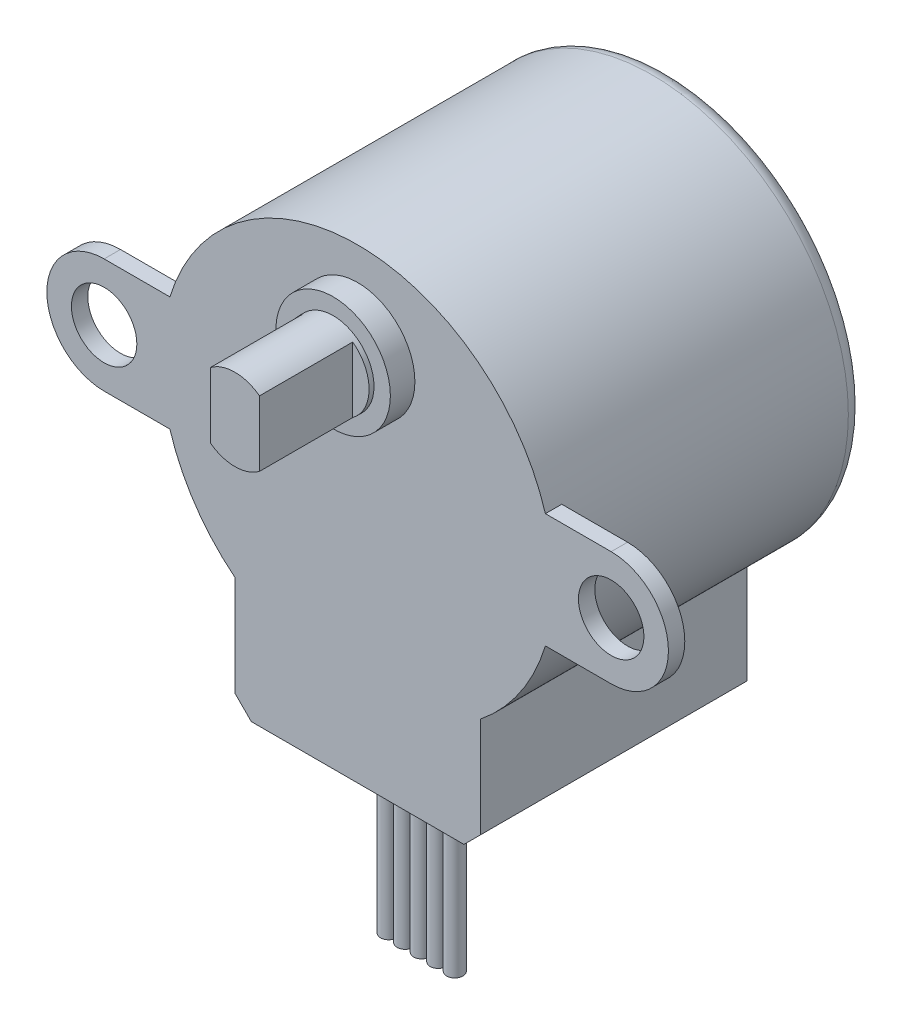
ISO-10303-21;
HEADER;
FILE_DESCRIPTION(('STEP AP214'),'2;1');
FILE_NAME('part.step','',(''),(''),'','','');
FILE_SCHEMA(('AUTOMOTIVE_DESIGN { 1 0 10303 214 1 1 1 1 }'));
ENDSEC;
DATA;
#1=APPLICATION_CONTEXT('core data for automotive mechanical design processes');
#2=APPLICATION_PROTOCOL_DEFINITION('international standard','automotive_design',2000,#1);
#3=PRODUCT_CONTEXT('',#1,'mechanical');
#4=PRODUCT('Part','Part','',(#3));
#5=PRODUCT_RELATED_PRODUCT_CATEGORY('part','',(#4));
#6=PRODUCT_DEFINITION_FORMATION('','',#4);
#7=PRODUCT_DEFINITION_CONTEXT('part definition',#1,'design');
#8=PRODUCT_DEFINITION('design','',#6,#7);
#9=PRODUCT_DEFINITION_SHAPE('','',#8);
#10=(LENGTH_UNIT() NAMED_UNIT(*) SI_UNIT(.MILLI.,.METRE.));
#11=(NAMED_UNIT(*) PLANE_ANGLE_UNIT() SI_UNIT($,.RADIAN.));
#12=(NAMED_UNIT(*) SI_UNIT($,.STERADIAN.) SOLID_ANGLE_UNIT());
#13=UNCERTAINTY_MEASURE_WITH_UNIT(LENGTH_MEASURE(1.E-05),#10,'distance_accuracy_value','');
#14=(GEOMETRIC_REPRESENTATION_CONTEXT(3) GLOBAL_UNCERTAINTY_ASSIGNED_CONTEXT((#13)) GLOBAL_UNIT_ASSIGNED_CONTEXT((#10,
#11,#12)) REPRESENTATION_CONTEXT('',''));
#15=CARTESIAN_POINT('',(0.,0.,0.));
#16=DIRECTION('',(0.,0.,1.));
#17=DIRECTION('',(1.,0.,0.));
#18=AXIS2_PLACEMENT_3D('',#15,#16,#17);
#19=CARTESIAN_POINT('',(0.,0.,19.));
#20=DIRECTION('',(0.,0.,-1.));
#21=DIRECTION('',(-1.,0.,0.));
#22=AXIS2_PLACEMENT_3D('',#19,#20,#21);
#23=CYLINDRICAL_SURFACE('',#22,12.);
#24=CARTESIAN_POINT('',(0.,0.,1.));
#25=DIRECTION('',(0.,0.,1.));
#26=DIRECTION('',(1.,0.,0.));
#27=AXIS2_PLACEMENT_3D('',#24,#25,#26);
#28=CIRCLE('',#27,12.);
#29=CARTESIAN_POINT('',(12.,0.,1.));
#30=VERTEX_POINT('',#29);
#31=EDGE_CURVE('E44',#30,#30,#28,.T.);
#32=ORIENTED_EDGE('',*,*,#31,.T.);
#33=EDGE_LOOP('',(#32));
#34=FACE_BOUND('',#33,.T.);
#35=CARTESIAN_POINT('',(0.,0.,2.7));
#36=DIRECTION('',(0.,0.,-1.));
#37=DIRECTION('',(1.,0.,0.));
#38=AXIS2_PLACEMENT_3D('',#35,#36,#37);
#39=CIRCLE('',#38,12.0000000000001);
#40=CARTESIAN_POINT('',(7.5,-9.3674969975976,2.7));
#41=VERTEX_POINT('',#40);
#42=CARTESIAN_POINT('',(-7.5,-9.3674969975976,2.7));
#43=VERTEX_POINT('',#42);
#44=EDGE_CURVE('E238',#41,#43,#39,.T.);
#45=ORIENTED_EDGE('',*,*,#44,.T.);
#46=DIRECTION('',(0.,0.,1.));
#47=VECTOR('',#46,1.);
#48=CARTESIAN_POINT('',(-7.5,-9.3674969975976,2.7));
#49=LINE('',#48,#47);
#50=CARTESIAN_POINT('',(-7.5,-9.3674969975976,19.));
#51=VERTEX_POINT('',#50);
#52=EDGE_CURVE('E248',#43,#51,#49,.T.);
#53=ORIENTED_EDGE('',*,*,#52,.T.);
#54=CARTESIAN_POINT('',(0.,0.,19.));
#55=DIRECTION('',(0.,0.,1.));
#56=DIRECTION('',(1.,0.,0.));
#57=AXIS2_PLACEMENT_3D('',#54,#55,#56);
#58=CIRCLE('',#57,12.);
#59=CARTESIAN_POINT('',(-11.478240283249,-3.5,19.));
#60=VERTEX_POINT('',#59);
#61=EDGE_CURVE('E286',#60,#51,#58,.T.);
#62=ORIENTED_EDGE('',*,*,#61,.F.);
#63=DIRECTION('',(0.,0.,1.));
#64=VECTOR('',#63,1.);
#65=CARTESIAN_POINT('',(-11.478240283249,-3.49999999999999,18.));
#66=LINE('',#65,#64);
#67=CARTESIAN_POINT('',(-11.478240283249,-3.49999999999999,18.));
#68=VERTEX_POINT('',#67);
#69=EDGE_CURVE('E361',#68,#60,#66,.T.);
#70=ORIENTED_EDGE('',*,*,#69,.F.);
#71=CARTESIAN_POINT('',(3.17454396103756E-13,0.,18.));
#72=DIRECTION('',(0.,0.,-1.));
#73=DIRECTION('',(1.,0.,0.));
#74=AXIS2_PLACEMENT_3D('',#71,#72,#73);
#75=CIRCLE('',#74,12.0000000000003);
#76=CARTESIAN_POINT('',(-11.478240283249,3.5,18.));
#77=VERTEX_POINT('',#76);
#78=EDGE_CURVE('E342',#68,#77,#75,.T.);
#79=ORIENTED_EDGE('',*,*,#78,.T.);
#80=DIRECTION('',(0.,0.,1.));
#81=VECTOR('',#80,1.);
#82=CARTESIAN_POINT('',(-11.478240283249,3.5,18.));
#83=LINE('',#82,#81);
#84=CARTESIAN_POINT('',(-11.478240283249,3.5,19.));
#85=VERTEX_POINT('',#84);
#86=EDGE_CURVE('E358',#77,#85,#83,.T.);
#87=ORIENTED_EDGE('',*,*,#86,.T.);
#88=CARTESIAN_POINT('',(11.478240283249,3.50000000000001,19.));
#89=VERTEX_POINT('',#88);
#90=EDGE_CURVE('E357',#89,#85,#58,.T.);
#91=ORIENTED_EDGE('',*,*,#90,.F.);
#92=DIRECTION('',(0.,0.,1.));
#93=VECTOR('',#92,1.);
#94=CARTESIAN_POINT('',(11.478240283249,3.50000000000001,18.));
#95=LINE('',#94,#93);
#96=CARTESIAN_POINT('',(11.478240283249,3.50000000000001,18.));
#97=VERTEX_POINT('',#96);
#98=EDGE_CURVE('E319',#97,#89,#95,.T.);
#99=ORIENTED_EDGE('',*,*,#98,.F.);
#100=CARTESIAN_POINT('',(3.17454396103756E-13,0.,18.));
#101=DIRECTION('',(0.,0.,-1.));
#102=DIRECTION('',(-1.,0.,0.));
#103=AXIS2_PLACEMENT_3D('',#100,#101,#102);
#104=CIRCLE('',#103,11.9999999999997);
#105=CARTESIAN_POINT('',(11.478240283249,-3.49999999999999,18.));
#106=VERTEX_POINT('',#105);
#107=EDGE_CURVE('E299',#97,#106,#104,.T.);
#108=ORIENTED_EDGE('',*,*,#107,.T.);
#109=DIRECTION('',(0.,0.,1.));
#110=VECTOR('',#109,1.);
#111=CARTESIAN_POINT('',(11.478240283249,-3.49999999999999,18.));
#112=LINE('',#111,#110);
#113=CARTESIAN_POINT('',(11.478240283249,-3.49999999999999,19.));
#114=VERTEX_POINT('',#113);
#115=EDGE_CURVE('E312',#106,#114,#112,.T.);
#116=ORIENTED_EDGE('',*,*,#115,.T.);
#117=CARTESIAN_POINT('',(7.5,-9.3674969975976,19.));
#118=VERTEX_POINT('',#117);
#119=EDGE_CURVE('E367',#118,#114,#58,.T.);
#120=ORIENTED_EDGE('',*,*,#119,.F.);
#121=DIRECTION('',(0.,0.,1.));
#122=VECTOR('',#121,1.);
#123=CARTESIAN_POINT('',(7.5,-9.3674969975976,2.7));
#124=LINE('',#123,#122);
#125=EDGE_CURVE('E241',#41,#118,#124,.T.);
#126=ORIENTED_EDGE('',*,*,#125,.F.);
#127=EDGE_LOOP('',(#45,#53,#62,#70,#79,#87,#91,#99,#108,#116,#120,#126));
#128=FACE_BOUND('',#127,.T.);
#129=ADVANCED_FACE('F36',(#34,#128),#23,.T.);
#130=CARTESIAN_POINT('',(0.,0.,19.));
#131=DIRECTION('',(0.,0.,1.));
#132=DIRECTION('',(1.,0.,0.));
#133=AXIS2_PLACEMENT_3D('',#130,#131,#132);
#134=PLANE('',#133);
#135=CARTESIAN_POINT('',(0.,6.5,19.));
#136=DIRECTION('',(0.,0.,1.));
#137=DIRECTION('',(1.,0.,0.));
#138=AXIS2_PLACEMENT_3D('',#135,#136,#137);
#139=CIRCLE('',#138,3.5);
#140=CARTESIAN_POINT('',(3.5,6.5,19.));
#141=VERTEX_POINT('',#140);
#142=EDGE_CURVE('E281',#141,#141,#139,.T.);
#143=ORIENTED_EDGE('',*,*,#142,.F.);
#144=EDGE_LOOP('',(#143));
#145=FACE_BOUND('',#144,.T.);
#146=DIRECTION('',(1.,0.,0.));
#147=VECTOR('',#146,1.);
#148=CARTESIAN_POINT('',(-7.5,-16.5,19.));
#149=LINE('',#148,#147);
#150=CARTESIAN_POINT('',(-6.5,-16.5,19.));
#151=VERTEX_POINT('',#150);
#152=CARTESIAN_POINT('',(6.5,-16.5,19.));
#153=VERTEX_POINT('',#152);
#154=EDGE_CURVE('E244',#151,#153,#149,.T.);
#155=ORIENTED_EDGE('',*,*,#154,.T.);
#156=DIRECTION('',(-0.707106781186548,-0.707106781186548,0.));
#157=VECTOR('',#156,1.);
#158=CARTESIAN_POINT('',(11.5,-11.5,19.));
#159=LINE('',#158,#157);
#160=CARTESIAN_POINT('',(7.5,-15.5,19.));
#161=VERTEX_POINT('',#160);
#162=EDGE_CURVE('E374',#153,#161,#159,.F.);
#163=ORIENTED_EDGE('',*,*,#162,.T.);
#164=DIRECTION('',(0.,1.,0.));
#165=VECTOR('',#164,1.);
#166=CARTESIAN_POINT('',(7.5,-16.5,19.));
#167=LINE('',#166,#165);
#168=EDGE_CURVE('E233',#161,#118,#167,.T.);
#169=ORIENTED_EDGE('',*,*,#168,.T.);
#170=ORIENTED_EDGE('',*,*,#119,.T.);
#171=DIRECTION('',(1.,0.,0.));
#172=VECTOR('',#171,1.);
#173=CARTESIAN_POINT('',(15.5,-3.49999999999999,19.));
#174=LINE('',#173,#172);
#175=CARTESIAN_POINT('',(15.5,-3.49999999999999,19.));
#176=VERTEX_POINT('',#175);
#177=EDGE_CURVE('E296',#114,#176,#174,.T.);
#178=ORIENTED_EDGE('',*,*,#177,.T.);
#179=CARTESIAN_POINT('',(15.5,0.,19.));
#180=DIRECTION('',(0.,0.,1.));
#181=DIRECTION('',(-1.,0.,0.));
#182=AXIS2_PLACEMENT_3D('',#179,#180,#181);
#183=CIRCLE('',#182,3.5);
#184=CARTESIAN_POINT('',(15.5,3.50000000000001,19.));
#185=VERTEX_POINT('',#184);
#186=EDGE_CURVE('E315',#176,#185,#183,.T.);
#187=ORIENTED_EDGE('',*,*,#186,.T.);
#188=DIRECTION('',(-1.,0.,0.));
#189=VECTOR('',#188,1.);
#190=CARTESIAN_POINT('',(15.5,3.50000000000001,19.));
#191=LINE('',#190,#189);
#192=EDGE_CURVE('E303',#185,#89,#191,.T.);
#193=ORIENTED_EDGE('',*,*,#192,.T.);
#194=ORIENTED_EDGE('',*,*,#90,.T.);
#195=DIRECTION('',(-1.,0.,0.));
#196=VECTOR('',#195,1.);
#197=CARTESIAN_POINT('',(-15.5,3.5,19.));
#198=LINE('',#197,#196);
#199=CARTESIAN_POINT('',(-15.5,3.5,19.));
#200=VERTEX_POINT('',#199);
#201=EDGE_CURVE('E339',#85,#200,#198,.T.);
#202=ORIENTED_EDGE('',*,*,#201,.T.);
#203=CARTESIAN_POINT('',(-15.5,0.,19.));
#204=DIRECTION('',(0.,0.,1.));
#205=DIRECTION('',(1.,0.,0.));
#206=AXIS2_PLACEMENT_3D('',#203,#204,#205);
#207=CIRCLE('',#206,3.5);
#208=CARTESIAN_POINT('',(-15.5,-3.5,19.));
#209=VERTEX_POINT('',#208);
#210=EDGE_CURVE('E332',#200,#209,#207,.T.);
#211=ORIENTED_EDGE('',*,*,#210,.T.);
#212=DIRECTION('',(1.,0.,0.));
#213=VECTOR('',#212,1.);
#214=CARTESIAN_POINT('',(-15.5,-3.5,19.));
#215=LINE('',#214,#213);
#216=EDGE_CURVE('E351',#209,#60,#215,.T.);
#217=ORIENTED_EDGE('',*,*,#216,.T.);
#218=ORIENTED_EDGE('',*,*,#61,.T.);
#219=DIRECTION('',(0.,-1.,0.));
#220=VECTOR('',#219,1.);
#221=CARTESIAN_POINT('',(-7.5,-16.5,19.));
#222=LINE('',#221,#220);
#223=CARTESIAN_POINT('',(-7.5,-15.5,19.));
#224=VERTEX_POINT('',#223);
#225=EDGE_CURVE('E226',#51,#224,#222,.T.);
#226=ORIENTED_EDGE('',*,*,#225,.T.);
#227=DIRECTION('',(-0.707106781186545,0.70710678118655,0.));
#228=VECTOR('',#227,1.);
#229=CARTESIAN_POINT('',(-11.5,-11.4999999999999,19.));
#230=LINE('',#229,#228);
#231=EDGE_CURVE('E372',#224,#151,#230,.F.);
#232=ORIENTED_EDGE('',*,*,#231,.T.);
#233=EDGE_LOOP('',(#155,#163,#169,#170,#178,#187,#193,#194,#202,#211,#217,#218,#226,#232));
#234=FACE_BOUND('',#233,.T.);
#235=CARTESIAN_POINT('',(-15.5,0.,19.));
#236=DIRECTION('',(0.,0.,1.));
#237=DIRECTION('',(1.,0.,0.));
#238=AXIS2_PLACEMENT_3D('',#235,#236,#237);
#239=CIRCLE('',#238,2.);
#240=CARTESIAN_POINT('',(-13.5,0.,19.));
#241=VERTEX_POINT('',#240);
#242=EDGE_CURVE('E322',#241,#241,#239,.T.);
#243=ORIENTED_EDGE('',*,*,#242,.F.);
#244=EDGE_LOOP('',(#243));
#245=FACE_BOUND('',#244,.T.);
#246=CARTESIAN_POINT('',(15.5,0.,19.));
#247=DIRECTION('',(0.,0.,1.));
#248=DIRECTION('',(-1.,0.,0.));
#249=AXIS2_PLACEMENT_3D('',#246,#247,#248);
#250=CIRCLE('',#249,2.);
#251=CARTESIAN_POINT('',(13.5,0.,19.));
#252=VERTEX_POINT('',#251);
#253=EDGE_CURVE('E290',#252,#252,#250,.T.);
#254=ORIENTED_EDGE('',*,*,#253,.F.);
#255=EDGE_LOOP('',(#254));
#256=FACE_BOUND('',#255,.T.);
#257=ADVANCED_FACE('F401',(#145,#234,#245,#256),#134,.T.);
#258=CARTESIAN_POINT('',(0.,0.,0.));
#259=DIRECTION('',(0.,0.,1.));
#260=DIRECTION('',(1.,0.,0.));
#261=AXIS2_PLACEMENT_3D('',#258,#259,#260);
#262=PLANE('',#261);
#263=CARTESIAN_POINT('',(0.,0.,0.));
#264=DIRECTION('',(0.,0.,1.));
#265=DIRECTION('',(1.,0.,0.));
#266=AXIS2_PLACEMENT_3D('',#263,#264,#265);
#267=CIRCLE('',#266,11.);
#268=CARTESIAN_POINT('',(11.,0.,0.));
#269=VERTEX_POINT('',#268);
#270=EDGE_CURVE('E11',#269,#269,#267,.F.);
#271=ORIENTED_EDGE('',*,*,#270,.T.);
#272=EDGE_LOOP('',(#271));
#273=FACE_BOUND('',#272,.T.);
#274=ADVANCED_FACE('F406',(#273),#262,.F.);
#275=CARTESIAN_POINT('',(-15.5,0.,18.));
#276=DIRECTION('',(0.,0.,1.));
#277=DIRECTION('',(1.,0.,0.));
#278=AXIS2_PLACEMENT_3D('',#275,#276,#277);
#279=CYLINDRICAL_SURFACE('',#278,3.5);
#280=ORIENTED_EDGE('',*,*,#210,.F.);
#281=DIRECTION('',(0.,0.,1.));
#282=VECTOR('',#281,1.);
#283=CARTESIAN_POINT('',(-15.5,3.5,18.));
#284=LINE('',#283,#282);
#285=CARTESIAN_POINT('',(-15.5,3.5,18.));
#286=VERTEX_POINT('',#285);
#287=EDGE_CURVE('E355',#286,#200,#284,.T.);
#288=ORIENTED_EDGE('',*,*,#287,.F.);
#289=CARTESIAN_POINT('',(-15.5,0.,18.));
#290=DIRECTION('',(0.,0.,1.));
#291=DIRECTION('',(1.,0.,0.));
#292=AXIS2_PLACEMENT_3D('',#289,#290,#291);
#293=CIRCLE('',#292,3.5);
#294=CARTESIAN_POINT('',(-15.5,-3.5,18.));
#295=VERTEX_POINT('',#294);
#296=EDGE_CURVE('E335',#286,#295,#293,.T.);
#297=ORIENTED_EDGE('',*,*,#296,.T.);
#298=DIRECTION('',(0.,0.,1.));
#299=VECTOR('',#298,1.);
#300=CARTESIAN_POINT('',(-15.5,-3.5,18.));
#301=LINE('',#300,#299);
#302=EDGE_CURVE('E348',#295,#209,#301,.T.);
#303=ORIENTED_EDGE('',*,*,#302,.T.);
#304=EDGE_LOOP('',(#280,#288,#297,#303));
#305=FACE_BOUND('',#304,.T.);
#306=ADVANCED_FACE('F468',(#305),#279,.T.);
#307=CARTESIAN_POINT('',(-15.5,3.5,18.));
#308=DIRECTION('',(0.,1.,0.));
#309=DIRECTION('',(0.,0.,1.));
#310=AXIS2_PLACEMENT_3D('',#307,#308,#309);
#311=PLANE('',#310);
#312=ORIENTED_EDGE('',*,*,#201,.F.);
#313=ORIENTED_EDGE('',*,*,#86,.F.);
#314=DIRECTION('',(-1.,0.,0.));
#315=VECTOR('',#314,1.);
#316=CARTESIAN_POINT('',(-15.5,3.5,18.));
#317=LINE('',#316,#315);
#318=EDGE_CURVE('E345',#77,#286,#317,.T.);
#319=ORIENTED_EDGE('',*,*,#318,.T.);
#320=ORIENTED_EDGE('',*,*,#287,.T.);
#321=EDGE_LOOP('',(#312,#313,#319,#320));
#322=FACE_BOUND('',#321,.T.);
#323=ADVANCED_FACE('F458',(#322),#311,.T.);
#324=CARTESIAN_POINT('',(-15.5,-3.5,18.));
#325=DIRECTION('',(0.,-1.,0.));
#326=DIRECTION('',(0.,0.,-1.));
#327=AXIS2_PLACEMENT_3D('',#324,#325,#326);
#328=PLANE('',#327);
#329=ORIENTED_EDGE('',*,*,#216,.F.);
#330=ORIENTED_EDGE('',*,*,#302,.F.);
#331=DIRECTION('',(1.,0.,0.));
#332=VECTOR('',#331,1.);
#333=CARTESIAN_POINT('',(-15.5,-3.5,18.));
#334=LINE('',#333,#332);
#335=EDGE_CURVE('E338',#295,#68,#334,.T.);
#336=ORIENTED_EDGE('',*,*,#335,.T.);
#337=ORIENTED_EDGE('',*,*,#69,.T.);
#338=EDGE_LOOP('',(#329,#330,#336,#337));
#339=FACE_BOUND('',#338,.T.);
#340=ADVANCED_FACE('F466',(#339),#328,.T.);
#341=CARTESIAN_POINT('',(-15.5,0.,18.));
#342=DIRECTION('',(0.,0.,1.));
#343=DIRECTION('',(1.,0.,0.));
#344=AXIS2_PLACEMENT_3D('',#341,#342,#343);
#345=PLANE('',#344);
#346=CARTESIAN_POINT('',(-15.5,0.,18.));
#347=DIRECTION('',(0.,0.,1.));
#348=DIRECTION('',(1.,0.,0.));
#349=AXIS2_PLACEMENT_3D('',#346,#347,#348);
#350=CIRCLE('',#349,2.);
#351=CARTESIAN_POINT('',(-13.5,0.,18.));
#352=VERTEX_POINT('',#351);
#353=EDGE_CURVE('E329',#352,#352,#350,.T.);
#354=ORIENTED_EDGE('',*,*,#353,.T.);
#355=EDGE_LOOP('',(#354));
#356=FACE_BOUND('',#355,.T.);
#357=ORIENTED_EDGE('',*,*,#296,.F.);
#358=ORIENTED_EDGE('',*,*,#318,.F.);
#359=ORIENTED_EDGE('',*,*,#78,.F.);
#360=ORIENTED_EDGE('',*,*,#335,.F.);
#361=EDGE_LOOP('',(#357,#358,#359,#360));
#362=FACE_BOUND('',#361,.T.);
#363=ADVANCED_FACE('F464',(#356,#362),#345,.F.);
#364=CARTESIAN_POINT('',(-15.5,0.,18.));
#365=DIRECTION('',(0.,0.,1.));
#366=DIRECTION('',(1.,0.,0.));
#367=AXIS2_PLACEMENT_3D('',#364,#365,#366);
#368=CYLINDRICAL_SURFACE('',#367,2.);
#369=ORIENTED_EDGE('',*,*,#353,.F.);
#370=EDGE_LOOP('',(#369));
#371=FACE_BOUND('',#370,.T.);
#372=ORIENTED_EDGE('',*,*,#242,.T.);
#373=EDGE_LOOP('',(#372));
#374=FACE_BOUND('',#373,.T.);
#375=ADVANCED_FACE('F482',(#371,#374),#368,.F.);
#376=CARTESIAN_POINT('',(15.5,3.50000000000001,18.));
#377=DIRECTION('',(0.,1.,0.));
#378=DIRECTION('',(0.,0.,1.));
#379=AXIS2_PLACEMENT_3D('',#376,#377,#378);
#380=PLANE('',#379);
#381=ORIENTED_EDGE('',*,*,#192,.F.);
#382=DIRECTION('',(0.,0.,1.));
#383=VECTOR('',#382,1.);
#384=CARTESIAN_POINT('',(15.5,3.50000000000001,18.));
#385=LINE('',#384,#383);
#386=CARTESIAN_POINT('',(15.5,3.50000000000001,18.));
#387=VERTEX_POINT('',#386);
#388=EDGE_CURVE('E323',#387,#185,#385,.T.);
#389=ORIENTED_EDGE('',*,*,#388,.F.);
#390=DIRECTION('',(-1.,0.,0.));
#391=VECTOR('',#390,1.);
#392=CARTESIAN_POINT('',(15.5,3.50000000000001,18.));
#393=LINE('',#392,#391);
#394=EDGE_CURVE('E309',#387,#97,#393,.T.);
#395=ORIENTED_EDGE('',*,*,#394,.T.);
#396=ORIENTED_EDGE('',*,*,#98,.T.);
#397=EDGE_LOOP('',(#381,#389,#395,#396));
#398=FACE_BOUND('',#397,.T.);
#399=ADVANCED_FACE('F453',(#398),#380,.T.);
#400=CARTESIAN_POINT('',(15.5,0.,18.));
#401=DIRECTION('',(0.,0.,1.));
#402=DIRECTION('',(1.,0.,0.));
#403=AXIS2_PLACEMENT_3D('',#400,#401,#402);
#404=CYLINDRICAL_SURFACE('',#403,3.5);
#405=ORIENTED_EDGE('',*,*,#186,.F.);
#406=DIRECTION('',(0.,0.,1.));
#407=VECTOR('',#406,1.);
#408=CARTESIAN_POINT('',(15.5,-3.49999999999999,18.));
#409=LINE('',#408,#407);
#410=CARTESIAN_POINT('',(15.5,-3.49999999999999,18.));
#411=VERTEX_POINT('',#410);
#412=EDGE_CURVE('E325',#411,#176,#409,.T.);
#413=ORIENTED_EDGE('',*,*,#412,.F.);
#414=CARTESIAN_POINT('',(15.5,0.,18.));
#415=DIRECTION('',(0.,0.,1.));
#416=DIRECTION('',(-1.,0.,0.));
#417=AXIS2_PLACEMENT_3D('',#414,#415,#416);
#418=CIRCLE('',#417,3.5);
#419=EDGE_CURVE('E306',#411,#387,#418,.T.);
#420=ORIENTED_EDGE('',*,*,#419,.T.);
#421=ORIENTED_EDGE('',*,*,#388,.T.);
#422=EDGE_LOOP('',(#405,#413,#420,#421));
#423=FACE_BOUND('',#422,.T.);
#424=ADVANCED_FACE('F455',(#423),#404,.T.);
#425=CARTESIAN_POINT('',(15.5,-3.49999999999999,18.));
#426=DIRECTION('',(0.,-1.,0.));
#427=DIRECTION('',(0.,0.,-1.));
#428=AXIS2_PLACEMENT_3D('',#425,#426,#427);
#429=PLANE('',#428);
#430=ORIENTED_EDGE('',*,*,#177,.F.);
#431=ORIENTED_EDGE('',*,*,#115,.F.);
#432=DIRECTION('',(1.,0.,0.));
#433=VECTOR('',#432,1.);
#434=CARTESIAN_POINT('',(15.5,-3.49999999999999,18.));
#435=LINE('',#434,#433);
#436=EDGE_CURVE('E302',#106,#411,#435,.T.);
#437=ORIENTED_EDGE('',*,*,#436,.T.);
#438=ORIENTED_EDGE('',*,*,#412,.T.);
#439=EDGE_LOOP('',(#430,#431,#437,#438));
#440=FACE_BOUND('',#439,.T.);
#441=ADVANCED_FACE('F442',(#440),#429,.T.);
#442=CARTESIAN_POINT('',(3.17454396103756E-13,0.,18.));
#443=DIRECTION('',(0.,0.,-1.));
#444=DIRECTION('',(-1.,0.,0.));
#445=AXIS2_PLACEMENT_3D('',#442,#443,#444);
#446=PLANE('',#445);
#447=CARTESIAN_POINT('',(15.5,0.,18.));
#448=DIRECTION('',(0.,0.,1.));
#449=DIRECTION('',(-1.,0.,0.));
#450=AXIS2_PLACEMENT_3D('',#447,#448,#449);
#451=CIRCLE('',#450,2.);
#452=CARTESIAN_POINT('',(13.5,0.,18.));
#453=VERTEX_POINT('',#452);
#454=EDGE_CURVE('E293',#453,#453,#451,.T.);
#455=ORIENTED_EDGE('',*,*,#454,.T.);
#456=EDGE_LOOP('',(#455));
#457=FACE_BOUND('',#456,.T.);
#458=ORIENTED_EDGE('',*,*,#107,.F.);
#459=ORIENTED_EDGE('',*,*,#394,.F.);
#460=ORIENTED_EDGE('',*,*,#419,.F.);
#461=ORIENTED_EDGE('',*,*,#436,.F.);
#462=EDGE_LOOP('',(#458,#459,#460,#461));
#463=FACE_BOUND('',#462,.T.);
#464=ADVANCED_FACE('F449',(#457,#463),#446,.T.);
#465=CARTESIAN_POINT('',(15.5,0.,18.));
#466=DIRECTION('',(0.,0.,1.));
#467=DIRECTION('',(1.,0.,0.));
#468=AXIS2_PLACEMENT_3D('',#465,#466,#467);
#469=CYLINDRICAL_SURFACE('',#468,2.);
#470=ORIENTED_EDGE('',*,*,#454,.F.);
#471=EDGE_LOOP('',(#470));
#472=FACE_BOUND('',#471,.T.);
#473=ORIENTED_EDGE('',*,*,#253,.T.);
#474=EDGE_LOOP('',(#473));
#475=FACE_BOUND('',#474,.T.);
#476=ADVANCED_FACE('F495',(#472,#475),#469,.F.);
#477=CARTESIAN_POINT('',(0.,6.5,20.5));
#478=DIRECTION('',(0.,0.,-1.));
#479=DIRECTION('',(-1.,0.,0.));
#480=AXIS2_PLACEMENT_3D('',#477,#478,#479);
#481=CYLINDRICAL_SURFACE('',#480,3.5);
#482=CARTESIAN_POINT('',(0.,6.5,20.5));
#483=DIRECTION('',(0.,0.,1.));
#484=DIRECTION('',(1.,0.,0.));
#485=AXIS2_PLACEMENT_3D('',#482,#483,#484);
#486=CIRCLE('',#485,3.5);
#487=CARTESIAN_POINT('',(3.5,6.5,20.5));
#488=VERTEX_POINT('',#487);
#489=EDGE_CURVE('E287',#488,#488,#486,.T.);
#490=ORIENTED_EDGE('',*,*,#489,.F.);
#491=EDGE_LOOP('',(#490));
#492=FACE_BOUND('',#491,.T.);
#493=ORIENTED_EDGE('',*,*,#142,.T.);
#494=EDGE_LOOP('',(#493));
#495=FACE_BOUND('',#494,.T.);
#496=ADVANCED_FACE('F499',(#492,#495),#481,.T.);
#497=CARTESIAN_POINT('',(0.,6.5,20.5));
#498=DIRECTION('',(0.,0.,1.));
#499=DIRECTION('',(1.,0.,0.));
#500=AXIS2_PLACEMENT_3D('',#497,#498,#499);
#501=PLANE('',#500);
#502=CARTESIAN_POINT('',(0.,6.5,20.5));
#503=DIRECTION('',(0.,0.,1.));
#504=DIRECTION('',(1.,0.,0.));
#505=AXIS2_PLACEMENT_3D('',#502,#503,#504);
#506=CIRCLE('',#505,2.5);
#507=CARTESIAN_POINT('',(2.5,6.5,20.5));
#508=VERTEX_POINT('',#507);
#509=EDGE_CURVE('E282',#508,#508,#506,.T.);
#510=ORIENTED_EDGE('',*,*,#509,.F.);
#511=EDGE_LOOP('',(#510));
#512=FACE_BOUND('',#511,.T.);
#513=ORIENTED_EDGE('',*,*,#489,.T.);
#514=EDGE_LOOP('',(#513));
#515=FACE_BOUND('',#514,.T.);
#516=ADVANCED_FACE('F503',(#512,#515),#501,.T.);
#517=CARTESIAN_POINT('',(0.,6.5,26.5));
#518=DIRECTION('',(0.,0.,-1.));
#519=DIRECTION('',(-1.,0.,0.));
#520=AXIS2_PLACEMENT_3D('',#517,#518,#519);
#521=CYLINDRICAL_SURFACE('',#520,2.5);
#522=CARTESIAN_POINT('',(0.,6.5,26.5));
#523=DIRECTION('',(0.,0.,1.));
#524=DIRECTION('',(1.,0.,0.));
#525=AXIS2_PLACEMENT_3D('',#522,#523,#524);
#526=CIRCLE('',#525,2.5);
#527=CARTESIAN_POINT('',(-1.5,4.5,26.5));
#528=VERTEX_POINT('',#527);
#529=CARTESIAN_POINT('',(1.5,4.5,26.5));
#530=VERTEX_POINT('',#529);
#531=EDGE_CURVE('E266',#528,#530,#526,.T.);
#532=ORIENTED_EDGE('',*,*,#531,.F.);
#533=DIRECTION('',(0.,0.,1.));
#534=VECTOR('',#533,1.);
#535=CARTESIAN_POINT('',(-1.5,4.5,20.8));
#536=LINE('',#535,#534);
#537=CARTESIAN_POINT('',(-1.5,4.5,20.8));
#538=VERTEX_POINT('',#537);
#539=EDGE_CURVE('E260',#538,#528,#536,.T.);
#540=ORIENTED_EDGE('',*,*,#539,.F.);
#541=CARTESIAN_POINT('',(0.,6.5,20.8));
#542=DIRECTION('',(0.,0.,1.));
#543=DIRECTION('',(1.,0.,0.));
#544=AXIS2_PLACEMENT_3D('',#541,#542,#543);
#545=CIRCLE('',#544,2.5);
#546=CARTESIAN_POINT('',(-1.5,8.5,20.8));
#547=VERTEX_POINT('',#546);
#548=EDGE_CURVE('E254',#547,#538,#545,.T.);
#549=ORIENTED_EDGE('',*,*,#548,.F.);
#550=DIRECTION('',(0.,0.,1.));
#551=VECTOR('',#550,1.);
#552=CARTESIAN_POINT('',(-1.5,8.5,20.8));
#553=LINE('',#552,#551);
#554=CARTESIAN_POINT('',(-1.5,8.5,26.5));
#555=VERTEX_POINT('',#554);
#556=EDGE_CURVE('E263',#547,#555,#553,.T.);
#557=ORIENTED_EDGE('',*,*,#556,.T.);
#558=CARTESIAN_POINT('',(1.5,8.5,26.5));
#559=VERTEX_POINT('',#558);
#560=EDGE_CURVE('E278',#559,#555,#526,.T.);
#561=ORIENTED_EDGE('',*,*,#560,.F.);
#562=DIRECTION('',(0.,0.,1.));
#563=VECTOR('',#562,1.);
#564=CARTESIAN_POINT('',(1.5,8.5,20.8));
#565=LINE('',#564,#563);
#566=CARTESIAN_POINT('',(1.5,8.5,20.8));
#567=VERTEX_POINT('',#566);
#568=EDGE_CURVE('E273',#567,#559,#565,.T.);
#569=ORIENTED_EDGE('',*,*,#568,.F.);
#570=CARTESIAN_POINT('',(0.,6.5,20.8));
#571=DIRECTION('',(0.,0.,1.));
#572=DIRECTION('',(-1.,0.,0.));
#573=AXIS2_PLACEMENT_3D('',#570,#571,#572);
#574=CIRCLE('',#573,2.5);
#575=CARTESIAN_POINT('',(1.5,4.5,20.8));
#576=VERTEX_POINT('',#575);
#577=EDGE_CURVE('E268',#576,#567,#574,.T.);
#578=ORIENTED_EDGE('',*,*,#577,.F.);
#579=DIRECTION('',(0.,0.,1.));
#580=VECTOR('',#579,1.);
#581=CARTESIAN_POINT('',(1.5,4.5,20.8));
#582=LINE('',#581,#580);
#583=EDGE_CURVE('E262',#576,#530,#582,.T.);
#584=ORIENTED_EDGE('',*,*,#583,.T.);
#585=EDGE_LOOP('',(#532,#540,#549,#557,#561,#569,#578,#584));
#586=FACE_BOUND('',#585,.T.);
#587=ORIENTED_EDGE('',*,*,#509,.T.);
#588=EDGE_LOOP('',(#587));
#589=FACE_BOUND('',#588,.T.);
#590=ADVANCED_FACE('F507',(#586,#589),#521,.T.);
#591=CARTESIAN_POINT('',(0.,6.5,26.5));
#592=DIRECTION('',(0.,0.,1.));
#593=DIRECTION('',(1.,0.,0.));
#594=AXIS2_PLACEMENT_3D('',#591,#592,#593);
#595=PLANE('',#594);
#596=DIRECTION('',(0.,1.,0.));
#597=VECTOR('',#596,1.);
#598=CARTESIAN_POINT('',(-1.5,8.5,26.5));
#599=LINE('',#598,#597);
#600=EDGE_CURVE('E257',#528,#555,#599,.T.);
#601=ORIENTED_EDGE('',*,*,#600,.F.);
#602=ORIENTED_EDGE('',*,*,#531,.T.);
#603=DIRECTION('',(0.,-1.,0.));
#604=VECTOR('',#603,1.);
#605=CARTESIAN_POINT('',(1.5,8.5,26.5));
#606=LINE('',#605,#604);
#607=EDGE_CURVE('E251',#559,#530,#606,.T.);
#608=ORIENTED_EDGE('',*,*,#607,.F.);
#609=ORIENTED_EDGE('',*,*,#560,.T.);
#610=EDGE_LOOP('',(#601,#602,#608,#609));
#611=FACE_BOUND('',#610,.T.);
#612=ADVANCED_FACE('F511',(#611),#595,.T.);
#613=CARTESIAN_POINT('',(1.5,8.5,20.8));
#614=DIRECTION('',(-1.,0.,0.));
#615=DIRECTION('',(0.,-1.,0.));
#616=AXIS2_PLACEMENT_3D('',#613,#614,#615);
#617=PLANE('',#616);
#618=ORIENTED_EDGE('',*,*,#607,.T.);
#619=ORIENTED_EDGE('',*,*,#583,.F.);
#620=DIRECTION('',(0.,-1.,0.));
#621=VECTOR('',#620,1.);
#622=CARTESIAN_POINT('',(1.5,8.5,20.8));
#623=LINE('',#622,#621);
#624=EDGE_CURVE('E270',#567,#576,#623,.T.);
#625=ORIENTED_EDGE('',*,*,#624,.F.);
#626=ORIENTED_EDGE('',*,*,#568,.T.);
#627=EDGE_LOOP('',(#618,#619,#625,#626));
#628=FACE_BOUND('',#627,.T.);
#629=ADVANCED_FACE('F515',(#628),#617,.F.);
#630=CARTESIAN_POINT('',(0.,6.5,20.8));
#631=DIRECTION('',(0.,0.,-1.));
#632=DIRECTION('',(-1.,0.,0.));
#633=AXIS2_PLACEMENT_3D('',#630,#631,#632);
#634=PLANE('',#633);
#635=ORIENTED_EDGE('',*,*,#577,.T.);
#636=ORIENTED_EDGE('',*,*,#624,.T.);
#637=EDGE_LOOP('',(#635,#636));
#638=FACE_BOUND('',#637,.T.);
#639=ADVANCED_FACE('F519',(#638),#634,.F.);
#640=CARTESIAN_POINT('',(-1.5,8.5,20.8));
#641=DIRECTION('',(1.,0.,0.));
#642=DIRECTION('',(0.,0.,-1.));
#643=AXIS2_PLACEMENT_3D('',#640,#641,#642);
#644=PLANE('',#643);
#645=ORIENTED_EDGE('',*,*,#600,.T.);
#646=ORIENTED_EDGE('',*,*,#556,.F.);
#647=DIRECTION('',(0.,1.,0.));
#648=VECTOR('',#647,1.);
#649=CARTESIAN_POINT('',(-1.5,8.5,20.8));
#650=LINE('',#649,#648);
#651=EDGE_CURVE('E256',#538,#547,#650,.T.);
#652=ORIENTED_EDGE('',*,*,#651,.F.);
#653=ORIENTED_EDGE('',*,*,#539,.T.);
#654=EDGE_LOOP('',(#645,#646,#652,#653));
#655=FACE_BOUND('',#654,.T.);
#656=ADVANCED_FACE('F523',(#655),#644,.F.);
#657=CARTESIAN_POINT('',(0.,6.5,20.8));
#658=DIRECTION('',(0.,0.,1.));
#659=DIRECTION('',(1.,0.,0.));
#660=AXIS2_PLACEMENT_3D('',#657,#658,#659);
#661=PLANE('',#660);
#662=ORIENTED_EDGE('',*,*,#548,.T.);
#663=ORIENTED_EDGE('',*,*,#651,.T.);
#664=EDGE_LOOP('',(#662,#663));
#665=FACE_BOUND('',#664,.T.);
#666=ADVANCED_FACE('F527',(#665),#661,.T.);
#667=CARTESIAN_POINT('',(-7.5,-16.5,2.7));
#668=DIRECTION('',(-1.,0.,0.));
#669=DIRECTION('',(0.,0.,1.));
#670=AXIS2_PLACEMENT_3D('',#667,#668,#669);
#671=PLANE('',#670);
#672=DIRECTION('',(0.,-1.,0.));
#673=VECTOR('',#672,1.);
#674=CARTESIAN_POINT('',(-7.5,-16.5,2.7));
#675=LINE('',#674,#673);
#676=CARTESIAN_POINT('',(-7.5,-15.5,2.7));
#677=VERTEX_POINT('',#676);
#678=EDGE_CURVE('E230',#43,#677,#675,.T.);
#679=ORIENTED_EDGE('',*,*,#678,.T.);
#680=DIRECTION('',(0.,0.,1.));
#681=VECTOR('',#680,1.);
#682=CARTESIAN_POINT('',(-7.5,-15.5,2.7));
#683=LINE('',#682,#681);
#684=EDGE_CURVE('E381',#677,#224,#683,.T.);
#685=ORIENTED_EDGE('',*,*,#684,.T.);
#686=ORIENTED_EDGE('',*,*,#225,.F.);
#687=ORIENTED_EDGE('',*,*,#52,.F.);
#688=EDGE_LOOP('',(#679,#685,#686,#687));
#689=FACE_BOUND('',#688,.T.);
#690=ADVANCED_FACE('F429',(#689),#671,.T.);
#691=CARTESIAN_POINT('',(7.5,-16.5,2.7));
#692=DIRECTION('',(1.,0.,0.));
#693=DIRECTION('',(0.,0.,-1.));
#694=AXIS2_PLACEMENT_3D('',#691,#692,#693);
#695=PLANE('',#694);
#696=ORIENTED_EDGE('',*,*,#168,.F.);
#697=DIRECTION('',(0.,0.,-1.));
#698=VECTOR('',#697,1.);
#699=CARTESIAN_POINT('',(7.5,-15.5,2.7));
#700=LINE('',#699,#698);
#701=CARTESIAN_POINT('',(7.5,-15.5,2.7));
#702=VERTEX_POINT('',#701);
#703=EDGE_CURVE('E376',#161,#702,#700,.T.);
#704=ORIENTED_EDGE('',*,*,#703,.T.);
#705=DIRECTION('',(0.,1.,0.));
#706=VECTOR('',#705,1.);
#707=CARTESIAN_POINT('',(7.5,-16.5,2.7));
#708=LINE('',#707,#706);
#709=EDGE_CURVE('E236',#702,#41,#708,.T.);
#710=ORIENTED_EDGE('',*,*,#709,.T.);
#711=ORIENTED_EDGE('',*,*,#125,.T.);
#712=EDGE_LOOP('',(#696,#704,#710,#711));
#713=FACE_BOUND('',#712,.T.);
#714=ADVANCED_FACE('F439',(#713),#695,.T.);
#715=CARTESIAN_POINT('',(-7.5,-16.5,2.7));
#716=DIRECTION('',(0.,-1.,0.));
#717=DIRECTION('',(1.,0.,0.));
#718=AXIS2_PLACEMENT_3D('',#715,#716,#717);
#719=PLANE('',#718);
#720=CARTESIAN_POINT('',(-3.5,-16.5,15.));
#721=DIRECTION('',(0.,-1.,0.));
#722=DIRECTION('',(1.,0.,0.));
#723=AXIS2_PLACEMENT_3D('',#720,#721,#722);
#724=CIRCLE('',#723,0.6);
#725=CARTESIAN_POINT('',(-3.5,-16.5,15.6));
#726=VERTEX_POINT('',#725);
#727=CARTESIAN_POINT('',(-3.5,-16.5,14.4));
#728=VERTEX_POINT('',#727);
#729=EDGE_CURVE('E51',#726,#728,#724,.T.);
#730=ORIENTED_EDGE('',*,*,#729,.F.);
#731=DIRECTION('',(-1.,0.,0.));
#732=VECTOR('',#731,1.);
#733=CARTESIAN_POINT('',(-3.5,-16.5,15.6));
#734=LINE('',#733,#732);
#735=CARTESIAN_POINT('',(3.5,-16.5,15.6));
#736=VERTEX_POINT('',#735);
#737=EDGE_CURVE('E207',#736,#726,#734,.T.);
#738=ORIENTED_EDGE('',*,*,#737,.F.);
#739=CARTESIAN_POINT('',(3.5,-16.5,15.));
#740=DIRECTION('',(0.,-1.,0.));
#741=DIRECTION('',(1.,0.,0.));
#742=AXIS2_PLACEMENT_3D('',#739,#740,#741);
#743=CIRCLE('',#742,0.6);
#744=CARTESIAN_POINT('',(3.5,-16.5,14.4));
#745=VERTEX_POINT('',#744);
#746=EDGE_CURVE('E210',#745,#736,#743,.T.);
#747=ORIENTED_EDGE('',*,*,#746,.F.);
#748=DIRECTION('',(1.,0.,0.));
#749=VECTOR('',#748,1.);
#750=CARTESIAN_POINT('',(-3.5,-16.5,14.4));
#751=LINE('',#750,#749);
#752=EDGE_CURVE('E219',#728,#745,#751,.T.);
#753=ORIENTED_EDGE('',*,*,#752,.F.);
#754=EDGE_LOOP('',(#730,#738,#747,#753));
#755=FACE_BOUND('',#754,.T.);
#756=DIRECTION('',(1.,0.,0.));
#757=VECTOR('',#756,1.);
#758=CARTESIAN_POINT('',(-7.5,-16.5,2.7));
#759=LINE('',#758,#757);
#760=CARTESIAN_POINT('',(-6.5,-16.5,2.7));
#761=VERTEX_POINT('',#760);
#762=CARTESIAN_POINT('',(6.5,-16.5,2.7));
#763=VERTEX_POINT('',#762);
#764=EDGE_CURVE('E232',#761,#763,#759,.T.);
#765=ORIENTED_EDGE('',*,*,#764,.T.);
#766=DIRECTION('',(0.,0.,1.));
#767=VECTOR('',#766,1.);
#768=CARTESIAN_POINT('',(6.5,-16.5,2.7));
#769=LINE('',#768,#767);
#770=EDGE_CURVE('E369',#763,#153,#769,.T.);
#771=ORIENTED_EDGE('',*,*,#770,.T.);
#772=ORIENTED_EDGE('',*,*,#154,.F.);
#773=DIRECTION('',(0.,0.,-1.));
#774=VECTOR('',#773,1.);
#775=CARTESIAN_POINT('',(-6.5,-16.5,2.7));
#776=LINE('',#775,#774);
#777=EDGE_CURVE('E285',#151,#761,#776,.T.);
#778=ORIENTED_EDGE('',*,*,#777,.T.);
#779=EDGE_LOOP('',(#765,#771,#772,#778));
#780=FACE_BOUND('',#779,.T.);
#781=ADVANCED_FACE('F417',(#755,#780),#719,.T.);
#782=CARTESIAN_POINT('',(0.,0.,2.7));
#783=DIRECTION('',(0.,0.,1.));
#784=DIRECTION('',(1.,0.,0.));
#785=AXIS2_PLACEMENT_3D('',#782,#783,#784);
#786=PLANE('',#785);
#787=ORIENTED_EDGE('',*,*,#709,.F.);
#788=DIRECTION('',(0.707106781186548,0.707106781186548,0.));
#789=VECTOR('',#788,1.);
#790=CARTESIAN_POINT('',(6.5,-16.5,2.7));
#791=LINE('',#790,#789);
#792=EDGE_CURVE('E379',#702,#763,#791,.F.);
#793=ORIENTED_EDGE('',*,*,#792,.T.);
#794=ORIENTED_EDGE('',*,*,#764,.F.);
#795=DIRECTION('',(0.707106781186545,-0.70710678118655,0.));
#796=VECTOR('',#795,1.);
#797=CARTESIAN_POINT('',(-7.5,-15.5,2.7));
#798=LINE('',#797,#796);
#799=EDGE_CURVE('E59',#761,#677,#798,.F.);
#800=ORIENTED_EDGE('',*,*,#799,.T.);
#801=ORIENTED_EDGE('',*,*,#678,.F.);
#802=ORIENTED_EDGE('',*,*,#44,.F.);
#803=EDGE_LOOP('',(#787,#793,#794,#800,#801,#802));
#804=FACE_BOUND('',#803,.T.);
#805=ADVANCED_FACE('F412',(#804),#786,.F.);
#806=CARTESIAN_POINT('',(6.5,-16.5,2.7));
#807=DIRECTION('',(-0.707106781186547,0.707106781186547,0.));
#808=DIRECTION('',(0.,0.,1.));
#809=AXIS2_PLACEMENT_3D('',#806,#807,#808);
#810=PLANE('',#809);
#811=ORIENTED_EDGE('',*,*,#792,.F.);
#812=ORIENTED_EDGE('',*,*,#703,.F.);
#813=ORIENTED_EDGE('',*,*,#162,.F.);
#814=ORIENTED_EDGE('',*,*,#770,.F.);
#815=EDGE_LOOP('',(#811,#812,#813,#814));
#816=FACE_BOUND('',#815,.T.);
#817=ADVANCED_FACE('F397',(#816),#810,.F.);
#818=CARTESIAN_POINT('',(-7.5,-15.5,2.7));
#819=DIRECTION('',(0.70710678118655,0.707106781186545,0.));
#820=DIRECTION('',(0.,0.,1.));
#821=AXIS2_PLACEMENT_3D('',#818,#819,#820);
#822=PLANE('',#821);
#823=ORIENTED_EDGE('',*,*,#799,.F.);
#824=ORIENTED_EDGE('',*,*,#777,.F.);
#825=ORIENTED_EDGE('',*,*,#231,.F.);
#826=ORIENTED_EDGE('',*,*,#684,.F.);
#827=EDGE_LOOP('',(#823,#824,#825,#826));
#828=FACE_BOUND('',#827,.T.);
#829=ADVANCED_FACE('F389',(#828),#822,.F.);
#830=CARTESIAN_POINT('',(0.,0.,1.));
#831=DIRECTION('',(0.,0.,1.));
#832=DIRECTION('',(1.,0.,0.));
#833=AXIS2_PLACEMENT_3D('',#830,#831,#832);
#834=TOROIDAL_SURFACE('',#833,11.,1.);
#835=ORIENTED_EDGE('',*,*,#270,.F.);
#836=EDGE_LOOP('',(#835));
#837=FACE_BOUND('',#836,.T.);
#838=ORIENTED_EDGE('',*,*,#31,.F.);
#839=EDGE_LOOP('',(#838));
#840=FACE_BOUND('',#839,.T.);
#841=ADVANCED_FACE('F38',(#837,#840),#834,.T.);
#842=CARTESIAN_POINT('',(-3.5,-14.5,15.));
#843=DIRECTION('',(0.,-1.,0.));
#844=DIRECTION('',(1.,0.,0.));
#845=AXIS2_PLACEMENT_3D('',#842,#843,#844);
#846=CYLINDRICAL_SURFACE('',#845,0.6);
#847=ORIENTED_EDGE('',*,*,#729,.T.);
#848=DIRECTION('',(0.,-1.,0.));
#849=VECTOR('',#848,1.);
#850=CARTESIAN_POINT('',(-3.5,-14.5,14.4));
#851=LINE('',#850,#849);
#852=CARTESIAN_POINT('',(-3.5,-14.5,14.4));
#853=VERTEX_POINT('',#852);
#854=EDGE_CURVE('E185',#853,#728,#851,.T.);
#855=ORIENTED_EDGE('',*,*,#854,.F.);
#856=CARTESIAN_POINT('',(-3.5,-14.5,15.));
#857=DIRECTION('',(0.,-1.,0.));
#858=DIRECTION('',(1.,0.,0.));
#859=AXIS2_PLACEMENT_3D('',#856,#857,#858);
#860=CIRCLE('',#859,0.6);
#861=CARTESIAN_POINT('',(-3.5,-14.5,15.6));
#862=VERTEX_POINT('',#861);
#863=EDGE_CURVE('E189',#862,#853,#860,.T.);
#864=ORIENTED_EDGE('',*,*,#863,.F.);
#865=DIRECTION('',(0.,-1.,0.));
#866=VECTOR('',#865,1.);
#867=CARTESIAN_POINT('',(-3.5,-14.5,15.6));
#868=LINE('',#867,#866);
#869=EDGE_CURVE('E224',#862,#726,#868,.T.);
#870=ORIENTED_EDGE('',*,*,#869,.T.);
#871=EDGE_LOOP('',(#847,#855,#864,#870));
#872=FACE_BOUND('',#871,.T.);
#873=ADVANCED_FACE('F187',(#872),#846,.F.);
#874=CARTESIAN_POINT('',(-3.5,-14.5,15.6));
#875=DIRECTION('',(0.,0.,1.));
#876=DIRECTION('',(1.,0.,0.));
#877=AXIS2_PLACEMENT_3D('',#874,#875,#876);
#878=PLANE('',#877);
#879=ORIENTED_EDGE('',*,*,#737,.T.);
#880=ORIENTED_EDGE('',*,*,#869,.F.);
#881=DIRECTION('',(-1.,0.,0.));
#882=VECTOR('',#881,1.);
#883=CARTESIAN_POINT('',(-3.5,-14.5,15.6));
#884=LINE('',#883,#882);
#885=CARTESIAN_POINT('',(3.5,-14.5,15.6));
#886=VERTEX_POINT('',#885);
#887=EDGE_CURVE('E195',#886,#862,#884,.T.);
#888=ORIENTED_EDGE('',*,*,#887,.F.);
#889=DIRECTION('',(0.,-1.,0.));
#890=VECTOR('',#889,1.);
#891=CARTESIAN_POINT('',(3.5,-14.5,15.6));
#892=LINE('',#891,#890);
#893=EDGE_CURVE('E227',#886,#736,#892,.T.);
#894=ORIENTED_EDGE('',*,*,#893,.T.);
#895=EDGE_LOOP('',(#879,#880,#888,#894));
#896=FACE_BOUND('',#895,.T.);
#897=ADVANCED_FACE('F395',(#896),#878,.F.);
#898=CARTESIAN_POINT('',(3.5,-14.5,15.));
#899=DIRECTION('',(0.,-1.,0.));
#900=DIRECTION('',(1.,0.,0.));
#901=AXIS2_PLACEMENT_3D('',#898,#899,#900);
#902=CYLINDRICAL_SURFACE('',#901,0.6);
#903=ORIENTED_EDGE('',*,*,#746,.T.);
#904=ORIENTED_EDGE('',*,*,#893,.F.);
#905=CARTESIAN_POINT('',(3.5,-14.5,15.));
#906=DIRECTION('',(0.,-1.,0.));
#907=DIRECTION('',(1.,0.,0.));
#908=AXIS2_PLACEMENT_3D('',#905,#906,#907);
#909=CIRCLE('',#908,0.6);
#910=CARTESIAN_POINT('',(3.5,-14.5,14.4));
#911=VERTEX_POINT('',#910);
#912=EDGE_CURVE('E203',#911,#886,#909,.T.);
#913=ORIENTED_EDGE('',*,*,#912,.F.);
#914=DIRECTION('',(0.,-1.,0.));
#915=VECTOR('',#914,1.);
#916=CARTESIAN_POINT('',(3.5,-14.5,14.4));
#917=LINE('',#916,#915);
#918=EDGE_CURVE('E194',#911,#745,#917,.T.);
#919=ORIENTED_EDGE('',*,*,#918,.T.);
#920=EDGE_LOOP('',(#903,#904,#913,#919));
#921=FACE_BOUND('',#920,.T.);
#922=ADVANCED_FACE('F541',(#921),#902,.F.);
#923=CARTESIAN_POINT('',(-3.5,-14.5,14.4));
#924=DIRECTION('',(0.,0.,-1.));
#925=DIRECTION('',(-1.,0.,0.));
#926=AXIS2_PLACEMENT_3D('',#923,#924,#925);
#927=PLANE('',#926);
#928=ORIENTED_EDGE('',*,*,#752,.T.);
#929=ORIENTED_EDGE('',*,*,#918,.F.);
#930=DIRECTION('',(1.,0.,0.));
#931=VECTOR('',#930,1.);
#932=CARTESIAN_POINT('',(-3.5,-14.5,14.4));
#933=LINE('',#932,#931);
#934=EDGE_CURVE('E198',#853,#911,#933,.T.);
#935=ORIENTED_EDGE('',*,*,#934,.F.);
#936=ORIENTED_EDGE('',*,*,#854,.T.);
#937=EDGE_LOOP('',(#928,#929,#935,#936));
#938=FACE_BOUND('',#937,.T.);
#939=ADVANCED_FACE('F199',(#938),#927,.F.);
#940=CARTESIAN_POINT('',(-3.5,-14.5,15.));
#941=DIRECTION('',(0.,-1.,0.));
#942=DIRECTION('',(1.,0.,0.));
#943=AXIS2_PLACEMENT_3D('',#940,#941,#942);
#944=PLANE('',#943);
#945=CARTESIAN_POINT('',(1.94,-14.5,15.));
#946=DIRECTION('',(0.,-1.,0.));
#947=DIRECTION('',(1.,0.,0.));
#948=AXIS2_PLACEMENT_3D('',#945,#946,#947);
#949=CIRCLE('',#948,0.500000000000001);
#950=CARTESIAN_POINT('',(2.44000000000001,-14.5,15.));
#951=VERTEX_POINT('',#950);
#952=EDGE_CURVE('E596',#951,#951,#949,.T.);
#953=ORIENTED_EDGE('',*,*,#952,.F.);
#954=EDGE_LOOP('',(#953));
#955=FACE_BOUND('',#954,.T.);
#956=CARTESIAN_POINT('',(0.930000000000004,-14.5,15.));
#957=DIRECTION('',(0.,-1.,0.));
#958=DIRECTION('',(1.,0.,0.));
#959=AXIS2_PLACEMENT_3D('',#956,#957,#958);
#960=CIRCLE('',#959,0.5);
#961=CARTESIAN_POINT('',(1.43,-14.5,15.));
#962=VERTEX_POINT('',#961);
#963=EDGE_CURVE('E595',#962,#962,#960,.T.);
#964=ORIENTED_EDGE('',*,*,#963,.F.);
#965=EDGE_LOOP('',(#964));
#966=FACE_BOUND('',#965,.T.);
#967=CARTESIAN_POINT('',(-0.079999999999996,-14.5,15.));
#968=DIRECTION('',(0.,-1.,0.));
#969=DIRECTION('',(1.,0.,0.));
#970=AXIS2_PLACEMENT_3D('',#967,#968,#969);
#971=CIRCLE('',#970,0.5);
#972=CARTESIAN_POINT('',(0.420000000000004,-14.5,15.));
#973=VERTEX_POINT('',#972);
#974=EDGE_CURVE('E605',#973,#973,#971,.T.);
#975=ORIENTED_EDGE('',*,*,#974,.F.);
#976=EDGE_LOOP('',(#975));
#977=FACE_BOUND('',#976,.T.);
#978=CARTESIAN_POINT('',(-1.09,-14.5,15.));
#979=DIRECTION('',(0.,-1.,0.));
#980=DIRECTION('',(1.,0.,0.));
#981=AXIS2_PLACEMENT_3D('',#978,#979,#980);
#982=CIRCLE('',#981,0.500000000000001);
#983=CARTESIAN_POINT('',(-0.589999999999996,-14.5,15.));
#984=VERTEX_POINT('',#983);
#985=EDGE_CURVE('E610',#984,#984,#982,.T.);
#986=ORIENTED_EDGE('',*,*,#985,.F.);
#987=EDGE_LOOP('',(#986));
#988=FACE_BOUND('',#987,.T.);
#989=CARTESIAN_POINT('',(-2.1,-14.5,15.));
#990=DIRECTION('',(0.,-1.,0.));
#991=DIRECTION('',(1.,0.,0.));
#992=AXIS2_PLACEMENT_3D('',#989,#990,#991);
#993=CIRCLE('',#992,0.5);
#994=CARTESIAN_POINT('',(-1.6,-14.5,15.));
#995=VERTEX_POINT('',#994);
#996=EDGE_CURVE('E213',#995,#995,#993,.T.);
#997=ORIENTED_EDGE('',*,*,#996,.F.);
#998=EDGE_LOOP('',(#997));
#999=FACE_BOUND('',#998,.T.);
#1000=ORIENTED_EDGE('',*,*,#863,.T.);
#1001=ORIENTED_EDGE('',*,*,#934,.T.);
#1002=ORIENTED_EDGE('',*,*,#912,.T.);
#1003=ORIENTED_EDGE('',*,*,#887,.T.);
#1004=EDGE_LOOP('',(#1000,#1001,#1002,#1003));
#1005=FACE_BOUND('',#1004,.T.);
#1006=ADVANCED_FACE('F205',(#955,#966,#977,#988,#999,#1005),#944,.T.);
#1007=CARTESIAN_POINT('',(-2.09999999999999,-27.5,15.));
#1008=DIRECTION('',(0.,1.,0.));
#1009=DIRECTION('',(-1.,0.,0.));
#1010=AXIS2_PLACEMENT_3D('',#1007,#1008,#1009);
#1011=CYLINDRICAL_SURFACE('',#1010,0.5);
#1012=CARTESIAN_POINT('',(-2.09999999999999,-27.5,15.));
#1013=DIRECTION('',(0.,-1.,0.));
#1014=DIRECTION('',(1.,0.,0.));
#1015=AXIS2_PLACEMENT_3D('',#1012,#1013,#1014);
#1016=CIRCLE('',#1015,0.5);
#1017=CARTESIAN_POINT('',(-1.59999999999999,-27.5,15.));
#1018=VERTEX_POINT('',#1017);
#1019=EDGE_CURVE('E220',#1018,#1018,#1016,.T.);
#1020=ORIENTED_EDGE('',*,*,#1019,.F.);
#1021=EDGE_LOOP('',(#1020));
#1022=FACE_BOUND('',#1021,.T.);
#1023=ORIENTED_EDGE('',*,*,#996,.T.);
#1024=EDGE_LOOP('',(#1023));
#1025=FACE_BOUND('',#1024,.T.);
#1026=ADVANCED_FACE('F550',(#1022,#1025),#1011,.T.);
#1027=CARTESIAN_POINT('',(-2.09999999999999,-27.5,15.));
#1028=DIRECTION('',(0.,-1.,0.));
#1029=DIRECTION('',(1.,0.,0.));
#1030=AXIS2_PLACEMENT_3D('',#1027,#1028,#1029);
#1031=PLANE('',#1030);
#1032=ORIENTED_EDGE('',*,*,#1019,.T.);
#1033=EDGE_LOOP('',(#1032));
#1034=FACE_BOUND('',#1033,.T.);
#1035=ADVANCED_FACE('F554',(#1034),#1031,.T.);
#1036=CARTESIAN_POINT('',(-1.08999999999999,-27.5,15.));
#1037=DIRECTION('',(0.,1.,0.));
#1038=DIRECTION('',(-1.,0.,0.));
#1039=AXIS2_PLACEMENT_3D('',#1036,#1037,#1038);
#1040=CYLINDRICAL_SURFACE('',#1039,0.500000000000001);
#1041=CARTESIAN_POINT('',(-1.08999999999999,-27.5,15.));
#1042=DIRECTION('',(0.,-1.,0.));
#1043=DIRECTION('',(1.,0.,0.));
#1044=AXIS2_PLACEMENT_3D('',#1041,#1042,#1043);
#1045=CIRCLE('',#1044,0.500000000000001);
#1046=CARTESIAN_POINT('',(-0.589999999999992,-27.5,15.));
#1047=VERTEX_POINT('',#1046);
#1048=EDGE_CURVE('E613',#1047,#1047,#1045,.T.);
#1049=ORIENTED_EDGE('',*,*,#1048,.F.);
#1050=EDGE_LOOP('',(#1049));
#1051=FACE_BOUND('',#1050,.T.);
#1052=ORIENTED_EDGE('',*,*,#985,.T.);
#1053=EDGE_LOOP('',(#1052));
#1054=FACE_BOUND('',#1053,.T.);
#1055=ADVANCED_FACE('F558',(#1051,#1054),#1040,.T.);
#1056=CARTESIAN_POINT('',(-1.08999999999999,-27.5,15.));
#1057=DIRECTION('',(0.,-1.,0.));
#1058=DIRECTION('',(1.,0.,0.));
#1059=AXIS2_PLACEMENT_3D('',#1056,#1057,#1058);
#1060=PLANE('',#1059);
#1061=ORIENTED_EDGE('',*,*,#1048,.T.);
#1062=EDGE_LOOP('',(#1061));
#1063=FACE_BOUND('',#1062,.T.);
#1064=ADVANCED_FACE('F562',(#1063),#1060,.T.);
#1065=CARTESIAN_POINT('',(-0.079999999999993,-27.5,15.));
#1066=DIRECTION('',(0.,1.,0.));
#1067=DIRECTION('',(-1.,0.,0.));
#1068=AXIS2_PLACEMENT_3D('',#1065,#1066,#1067);
#1069=CYLINDRICAL_SURFACE('',#1068,0.5);
#1070=CARTESIAN_POINT('',(-0.079999999999993,-27.5,15.));
#1071=DIRECTION('',(0.,-1.,0.));
#1072=DIRECTION('',(1.,0.,0.));
#1073=AXIS2_PLACEMENT_3D('',#1070,#1071,#1072);
#1074=CIRCLE('',#1073,0.5);
#1075=CARTESIAN_POINT('',(0.420000000000007,-27.5,15.));
#1076=VERTEX_POINT('',#1075);
#1077=EDGE_CURVE('E607',#1076,#1076,#1074,.T.);
#1078=ORIENTED_EDGE('',*,*,#1077,.F.);
#1079=EDGE_LOOP('',(#1078));
#1080=FACE_BOUND('',#1079,.T.);
#1081=ORIENTED_EDGE('',*,*,#974,.T.);
#1082=EDGE_LOOP('',(#1081));
#1083=FACE_BOUND('',#1082,.T.);
#1084=ADVANCED_FACE('F566',(#1080,#1083),#1069,.T.);
#1085=CARTESIAN_POINT('',(-0.079999999999993,-27.5,15.));
#1086=DIRECTION('',(0.,-1.,0.));
#1087=DIRECTION('',(1.,0.,0.));
#1088=AXIS2_PLACEMENT_3D('',#1085,#1086,#1087);
#1089=PLANE('',#1088);
#1090=ORIENTED_EDGE('',*,*,#1077,.T.);
#1091=EDGE_LOOP('',(#1090));
#1092=FACE_BOUND('',#1091,.T.);
#1093=ADVANCED_FACE('F570',(#1092),#1089,.T.);
#1094=CARTESIAN_POINT('',(0.930000000000007,-27.5,15.));
#1095=DIRECTION('',(0.,1.,0.));
#1096=DIRECTION('',(-1.,0.,0.));
#1097=AXIS2_PLACEMENT_3D('',#1094,#1095,#1096);
#1098=CYLINDRICAL_SURFACE('',#1097,0.5);
#1099=CARTESIAN_POINT('',(0.930000000000007,-27.5,15.));
#1100=DIRECTION('',(0.,-1.,0.));
#1101=DIRECTION('',(1.,0.,0.));
#1102=AXIS2_PLACEMENT_3D('',#1099,#1100,#1101);
#1103=CIRCLE('',#1102,0.5);
#1104=CARTESIAN_POINT('',(1.43000000000001,-27.5,15.));
#1105=VERTEX_POINT('',#1104);
#1106=EDGE_CURVE('E599',#1105,#1105,#1103,.T.);
#1107=ORIENTED_EDGE('',*,*,#1106,.F.);
#1108=EDGE_LOOP('',(#1107));
#1109=FACE_BOUND('',#1108,.T.);
#1110=ORIENTED_EDGE('',*,*,#963,.T.);
#1111=EDGE_LOOP('',(#1110));
#1112=FACE_BOUND('',#1111,.T.);
#1113=ADVANCED_FACE('F574',(#1109,#1112),#1098,.T.);
#1114=CARTESIAN_POINT('',(0.930000000000007,-27.5,15.));
#1115=DIRECTION('',(0.,-1.,0.));
#1116=DIRECTION('',(1.,0.,0.));
#1117=AXIS2_PLACEMENT_3D('',#1114,#1115,#1116);
#1118=PLANE('',#1117);
#1119=ORIENTED_EDGE('',*,*,#1106,.T.);
#1120=EDGE_LOOP('',(#1119));
#1121=FACE_BOUND('',#1120,.T.);
#1122=ADVANCED_FACE('F578',(#1121),#1118,.T.);
#1123=CARTESIAN_POINT('',(1.94000000000001,-27.5,15.));
#1124=DIRECTION('',(0.,1.,0.));
#1125=DIRECTION('',(-1.,0.,0.));
#1126=AXIS2_PLACEMENT_3D('',#1123,#1124,#1125);
#1127=CYLINDRICAL_SURFACE('',#1126,0.500000000000001);
#1128=CARTESIAN_POINT('',(1.94000000000001,-27.5,15.));
#1129=DIRECTION('',(0.,-1.,0.));
#1130=DIRECTION('',(1.,0.,0.));
#1131=AXIS2_PLACEMENT_3D('',#1128,#1129,#1130);
#1132=CIRCLE('',#1131,0.500000000000001);
#1133=CARTESIAN_POINT('',(2.44000000000001,-27.5,15.));
#1134=VERTEX_POINT('',#1133);
#1135=EDGE_CURVE('E594',#1134,#1134,#1132,.T.);
#1136=ORIENTED_EDGE('',*,*,#1135,.F.);
#1137=EDGE_LOOP('',(#1136));
#1138=FACE_BOUND('',#1137,.T.);
#1139=ORIENTED_EDGE('',*,*,#952,.T.);
#1140=EDGE_LOOP('',(#1139));
#1141=FACE_BOUND('',#1140,.T.);
#1142=ADVANCED_FACE('F582',(#1138,#1141),#1127,.T.);
#1143=CARTESIAN_POINT('',(1.94000000000001,-27.5,15.));
#1144=DIRECTION('',(0.,-1.,0.));
#1145=DIRECTION('',(1.,0.,0.));
#1146=AXIS2_PLACEMENT_3D('',#1143,#1144,#1145);
#1147=PLANE('',#1146);
#1148=ORIENTED_EDGE('',*,*,#1135,.T.);
#1149=EDGE_LOOP('',(#1148));
#1150=FACE_BOUND('',#1149,.T.);
#1151=ADVANCED_FACE('F586',(#1150),#1147,.T.);
#1152=CLOSED_SHELL('',(#129,#257,#274,#306,#323,#340,#363,#375,#399,#424,#441,#464,#476,#496,
#516,#590,#612,#629,#639,#656,#666,#690,#714,#781,#805,#817,#829,#841,#873,#897,#922,#939,#1006,
#1026,#1035,#1055,#1064,#1084,#1093,#1113,#1122,#1142,#1151));
#1153=MANIFOLD_SOLID_BREP('B2',#1152);
#1154=ADVANCED_BREP_SHAPE_REPRESENTATION('',(#18,#1153),#14);
#1155=SHAPE_DEFINITION_REPRESENTATION(#9,#1154);
ENDSEC;
END-ISO-10303-21;
